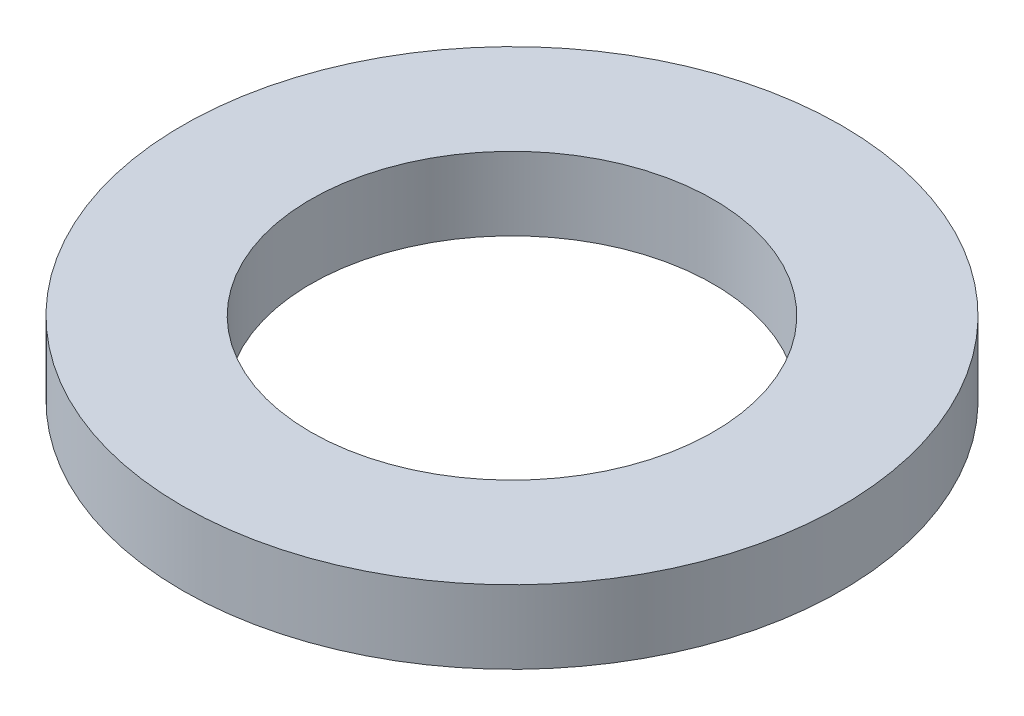
ISO-10303-21;
HEADER;
FILE_DESCRIPTION(('STEP AP214'),'2;1');
FILE_NAME('part.step','',(''),(''),'','','');
FILE_SCHEMA(('AUTOMOTIVE_DESIGN { 1 0 10303 214 1 1 1 1 }'));
ENDSEC;
DATA;
#1=APPLICATION_CONTEXT('core data for automotive mechanical design processes');
#2=APPLICATION_PROTOCOL_DEFINITION('international standard','automotive_design',2000,#1);
#3=PRODUCT_CONTEXT('',#1,'mechanical');
#4=PRODUCT('Part','Part','',(#3));
#5=PRODUCT_RELATED_PRODUCT_CATEGORY('part','',(#4));
#6=PRODUCT_DEFINITION_FORMATION('','',#4);
#7=PRODUCT_DEFINITION_CONTEXT('part definition',#1,'design');
#8=PRODUCT_DEFINITION('design','',#6,#7);
#9=PRODUCT_DEFINITION_SHAPE('','',#8);
#10=(LENGTH_UNIT() NAMED_UNIT(*) SI_UNIT(.MILLI.,.METRE.));
#11=(NAMED_UNIT(*) PLANE_ANGLE_UNIT() SI_UNIT($,.RADIAN.));
#12=(NAMED_UNIT(*) SI_UNIT($,.STERADIAN.) SOLID_ANGLE_UNIT());
#13=UNCERTAINTY_MEASURE_WITH_UNIT(LENGTH_MEASURE(1.E-05),#10,'distance_accuracy_value','');
#14=(GEOMETRIC_REPRESENTATION_CONTEXT(3) GLOBAL_UNCERTAINTY_ASSIGNED_CONTEXT((#13)) GLOBAL_UNIT_ASSIGNED_CONTEXT((#10,
#11,#12)) REPRESENTATION_CONTEXT('',''));
#15=CARTESIAN_POINT('',(0.,0.,0.));
#16=DIRECTION('',(0.,0.,1.));
#17=DIRECTION('',(1.,0.,0.));
#18=AXIS2_PLACEMENT_3D('',#15,#16,#17);
#19=CARTESIAN_POINT('',(0.,1.,0.));
#20=DIRECTION('',(0.,1.,0.));
#21=DIRECTION('',(0.,0.,1.));
#22=AXIS2_PLACEMENT_3D('',#19,#20,#21);
#23=PLANE('',#22);
#24=CARTESIAN_POINT('',(0.,1.,0.));
#25=DIRECTION('',(0.,1.,0.));
#26=DIRECTION('',(0.,0.,1.));
#27=AXIS2_PLACEMENT_3D('',#24,#25,#26);
#28=CIRCLE('',#27,4.5);
#29=CARTESIAN_POINT('',(0.,1.,4.5));
#30=VERTEX_POINT('',#29);
#31=EDGE_CURVE('E10',#30,#30,#28,.T.);
#32=ORIENTED_EDGE('',*,*,#31,.T.);
#33=EDGE_LOOP('',(#32));
#34=FACE_BOUND('',#33,.T.);
#35=CARTESIAN_POINT('',(0.,1.,0.));
#36=DIRECTION('',(0.,1.,0.));
#37=DIRECTION('',(0.,0.,1.));
#38=AXIS2_PLACEMENT_3D('',#35,#36,#37);
#39=CIRCLE('',#38,2.75);
#40=CARTESIAN_POINT('',(0.,1.,2.75));
#41=VERTEX_POINT('',#40);
#42=EDGE_CURVE('E57',#41,#41,#39,.T.);
#43=ORIENTED_EDGE('',*,*,#42,.F.);
#44=EDGE_LOOP('',(#43));
#45=FACE_BOUND('',#44,.T.);
#46=ADVANCED_FACE('F43',(#34,#45),#23,.T.);
#47=CARTESIAN_POINT('',(0.,0.,0.));
#48=DIRECTION('',(0.,1.,0.));
#49=DIRECTION('',(0.,0.,1.));
#50=AXIS2_PLACEMENT_3D('',#47,#48,#49);
#51=PLANE('',#50);
#52=CARTESIAN_POINT('',(0.,0.,0.));
#53=DIRECTION('',(0.,1.,0.));
#54=DIRECTION('',(0.,0.,1.));
#55=AXIS2_PLACEMENT_3D('',#52,#53,#54);
#56=CIRCLE('',#55,4.5);
#57=CARTESIAN_POINT('',(0.,0.,4.5));
#58=VERTEX_POINT('',#57);
#59=EDGE_CURVE('E47',#58,#58,#56,.T.);
#60=ORIENTED_EDGE('',*,*,#59,.F.);
#61=EDGE_LOOP('',(#60));
#62=FACE_BOUND('',#61,.T.);
#63=CARTESIAN_POINT('',(0.,0.,0.));
#64=DIRECTION('',(0.,1.,0.));
#65=DIRECTION('',(0.,0.,1.));
#66=AXIS2_PLACEMENT_3D('',#63,#64,#65);
#67=CIRCLE('',#66,2.75);
#68=CARTESIAN_POINT('',(0.,0.,2.75));
#69=VERTEX_POINT('',#68);
#70=EDGE_CURVE('E59',#69,#69,#67,.T.);
#71=ORIENTED_EDGE('',*,*,#70,.T.);
#72=EDGE_LOOP('',(#71));
#73=FACE_BOUND('',#72,.T.);
#74=ADVANCED_FACE('F70',(#62,#73),#51,.F.);
#75=CARTESIAN_POINT('',(0.,1.,0.));
#76=DIRECTION('',(0.,-1.,0.));
#77=DIRECTION('',(0.,0.,-1.));
#78=AXIS2_PLACEMENT_3D('',#75,#76,#77);
#79=CYLINDRICAL_SURFACE('',#78,4.5);
#80=ORIENTED_EDGE('',*,*,#31,.F.);
#81=EDGE_LOOP('',(#80));
#82=FACE_BOUND('',#81,.T.);
#83=ORIENTED_EDGE('',*,*,#59,.T.);
#84=EDGE_LOOP('',(#83));
#85=FACE_BOUND('',#84,.T.);
#86=ADVANCED_FACE('F45',(#82,#85),#79,.T.);
#87=CARTESIAN_POINT('',(0.,1.,0.));
#88=DIRECTION('',(0.,-1.,0.));
#89=DIRECTION('',(0.,0.,-1.));
#90=AXIS2_PLACEMENT_3D('',#87,#88,#89);
#91=CYLINDRICAL_SURFACE('',#90,2.75);
#92=ORIENTED_EDGE('',*,*,#42,.T.);
#93=EDGE_LOOP('',(#92));
#94=FACE_BOUND('',#93,.T.);
#95=ORIENTED_EDGE('',*,*,#70,.F.);
#96=EDGE_LOOP('',(#95));
#97=FACE_BOUND('',#96,.T.);
#98=ADVANCED_FACE('F66',(#94,#97),#91,.F.);
#99=CLOSED_SHELL('',(#46,#74,#86,#98));
#100=MANIFOLD_SOLID_BREP('B2',#99);
#101=ADVANCED_BREP_SHAPE_REPRESENTATION('',(#18,#100),#14);
#102=SHAPE_DEFINITION_REPRESENTATION(#9,#101);
ENDSEC;
END-ISO-10303-21;
